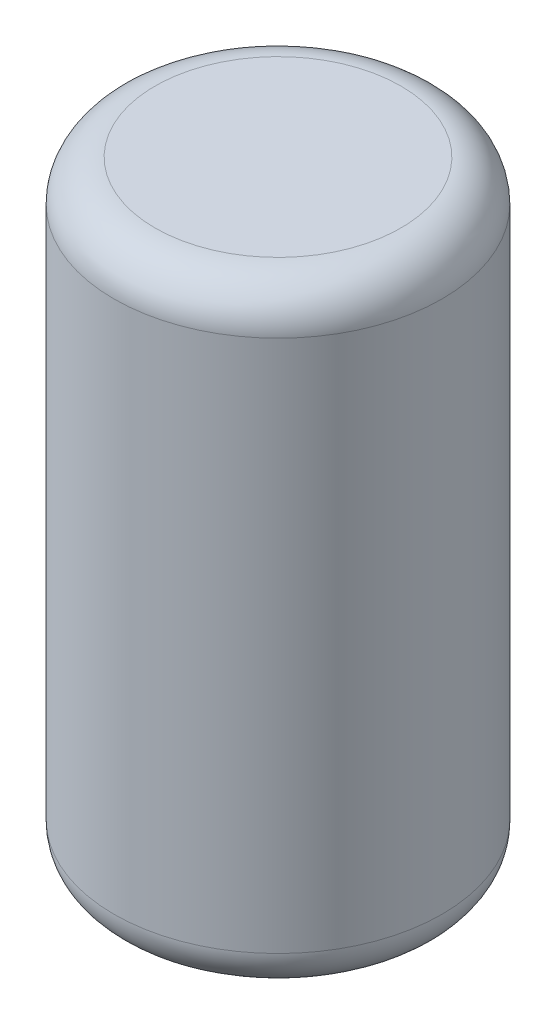
ISO-10303-21;
HEADER;
FILE_DESCRIPTION(('STEP AP214'),'2;1');
FILE_NAME('part.step','',(''),(''),'','','');
FILE_SCHEMA(('AUTOMOTIVE_DESIGN { 1 0 10303 214 1 1 1 1 }'));
ENDSEC;
DATA;
#1=APPLICATION_CONTEXT('core data for automotive mechanical design processes');
#2=APPLICATION_PROTOCOL_DEFINITION('international standard','automotive_design',2000,#1);
#3=PRODUCT_CONTEXT('',#1,'mechanical');
#4=PRODUCT('Part','Part','',(#3));
#5=PRODUCT_RELATED_PRODUCT_CATEGORY('part','',(#4));
#6=PRODUCT_DEFINITION_FORMATION('','',#4);
#7=PRODUCT_DEFINITION_CONTEXT('part definition',#1,'design');
#8=PRODUCT_DEFINITION('design','',#6,#7);
#9=PRODUCT_DEFINITION_SHAPE('','',#8);
#10=(LENGTH_UNIT() NAMED_UNIT(*) SI_UNIT(.MILLI.,.METRE.));
#11=(NAMED_UNIT(*) PLANE_ANGLE_UNIT() SI_UNIT($,.RADIAN.));
#12=(NAMED_UNIT(*) SI_UNIT($,.STERADIAN.) SOLID_ANGLE_UNIT());
#13=UNCERTAINTY_MEASURE_WITH_UNIT(LENGTH_MEASURE(1.E-05),#10,'distance_accuracy_value','');
#14=(GEOMETRIC_REPRESENTATION_CONTEXT(3) GLOBAL_UNCERTAINTY_ASSIGNED_CONTEXT((#13)) GLOBAL_UNIT_ASSIGNED_CONTEXT((#10,
#11,#12)) REPRESENTATION_CONTEXT('',''));
#15=CARTESIAN_POINT('',(0.,0.,0.));
#16=DIRECTION('',(0.,0.,1.));
#17=DIRECTION('',(1.,0.,0.));
#18=AXIS2_PLACEMENT_3D('',#15,#16,#17);
#19=CARTESIAN_POINT('',(0.,12.75,0.));
#20=DIRECTION('',(0.,-1.,0.));
#21=DIRECTION('',(0.,0.,-1.));
#22=AXIS2_PLACEMENT_3D('',#19,#20,#21);
#23=CYLINDRICAL_SURFACE('',#22,2.8);
#24=CARTESIAN_POINT('',(0.,2.95,0.));
#25=DIRECTION('',(0.,1.,0.));
#26=DIRECTION('',(0.,0.,1.));
#27=AXIS2_PLACEMENT_3D('',#24,#25,#26);
#28=CIRCLE('',#27,2.8);
#29=CARTESIAN_POINT('',(0.,2.95,2.8));
#30=VERTEX_POINT('',#29);
#31=EDGE_CURVE('E44',#30,#30,#28,.T.);
#32=ORIENTED_EDGE('',*,*,#31,.T.);
#33=EDGE_LOOP('',(#32));
#34=FACE_BOUND('',#33,.T.);
#35=CARTESIAN_POINT('',(0.,12.05,0.));
#36=DIRECTION('',(0.,1.,0.));
#37=DIRECTION('',(0.,0.,1.));
#38=AXIS2_PLACEMENT_3D('',#35,#36,#37);
#39=CIRCLE('',#38,2.8);
#40=CARTESIAN_POINT('',(0.,12.05,2.8));
#41=VERTEX_POINT('',#40);
#42=EDGE_CURVE('E48',#41,#41,#39,.F.);
#43=ORIENTED_EDGE('',*,*,#42,.T.);
#44=EDGE_LOOP('',(#43));
#45=FACE_BOUND('',#44,.T.);
#46=ADVANCED_FACE('F33',(#34,#45),#23,.T.);
#47=CARTESIAN_POINT('',(0.,12.75,0.));
#48=DIRECTION('',(0.,1.,0.));
#49=DIRECTION('',(0.,0.,1.));
#50=AXIS2_PLACEMENT_3D('',#47,#48,#49);
#51=PLANE('',#50);
#52=CARTESIAN_POINT('',(0.,12.75,0.));
#53=DIRECTION('',(0.,1.,0.));
#54=DIRECTION('',(0.,0.,1.));
#55=AXIS2_PLACEMENT_3D('',#52,#53,#54);
#56=CIRCLE('',#55,2.1);
#57=CARTESIAN_POINT('',(0.,12.75,2.1));
#58=VERTEX_POINT('',#57);
#59=EDGE_CURVE('E10',#58,#58,#56,.T.);
#60=ORIENTED_EDGE('',*,*,#59,.T.);
#61=EDGE_LOOP('',(#60));
#62=FACE_BOUND('',#61,.T.);
#63=ADVANCED_FACE('F64',(#62),#51,.T.);
#64=CARTESIAN_POINT('',(0.,2.25,0.));
#65=DIRECTION('',(0.,1.,0.));
#66=DIRECTION('',(0.,0.,1.));
#67=AXIS2_PLACEMENT_3D('',#64,#65,#66);
#68=PLANE('',#67);
#69=CARTESIAN_POINT('',(0.,2.25,0.));
#70=DIRECTION('',(0.,1.,0.));
#71=DIRECTION('',(0.,0.,1.));
#72=AXIS2_PLACEMENT_3D('',#69,#70,#71);
#73=CIRCLE('',#72,2.1);
#74=CARTESIAN_POINT('',(0.,2.25,2.1));
#75=VERTEX_POINT('',#74);
#76=EDGE_CURVE('E40',#75,#75,#73,.F.);
#77=ORIENTED_EDGE('',*,*,#76,.T.);
#78=EDGE_LOOP('',(#77));
#79=FACE_BOUND('',#78,.T.);
#80=ADVANCED_FACE('F61',(#79),#68,.F.);
#81=CARTESIAN_POINT('',(0.,2.95,0.));
#82=DIRECTION('',(0.,1.,0.));
#83=DIRECTION('',(0.,0.,1.));
#84=AXIS2_PLACEMENT_3D('',#81,#82,#83);
#85=TOROIDAL_SURFACE('',#84,2.1,0.7);
#86=ORIENTED_EDGE('',*,*,#76,.F.);
#87=EDGE_LOOP('',(#86));
#88=FACE_BOUND('',#87,.T.);
#89=ORIENTED_EDGE('',*,*,#31,.F.);
#90=EDGE_LOOP('',(#89));
#91=FACE_BOUND('',#90,.T.);
#92=ADVANCED_FACE('F57',(#88,#91),#85,.T.);
#93=CARTESIAN_POINT('',(0.,12.05,0.));
#94=DIRECTION('',(0.,1.,0.));
#95=DIRECTION('',(0.,0.,1.));
#96=AXIS2_PLACEMENT_3D('',#93,#94,#95);
#97=TOROIDAL_SURFACE('',#96,2.1,0.7);
#98=ORIENTED_EDGE('',*,*,#42,.F.);
#99=EDGE_LOOP('',(#98));
#100=FACE_BOUND('',#99,.T.);
#101=ORIENTED_EDGE('',*,*,#59,.F.);
#102=EDGE_LOOP('',(#101));
#103=FACE_BOUND('',#102,.T.);
#104=ADVANCED_FACE('F35',(#100,#103),#97,.T.);
#105=CLOSED_SHELL('',(#46,#63,#80,#92,#104));
#106=MANIFOLD_SOLID_BREP('B2',#105);
#107=ADVANCED_BREP_SHAPE_REPRESENTATION('',(#18,#106),#14);
#108=SHAPE_DEFINITION_REPRESENTATION(#9,#107);
ENDSEC;
END-ISO-10303-21;
